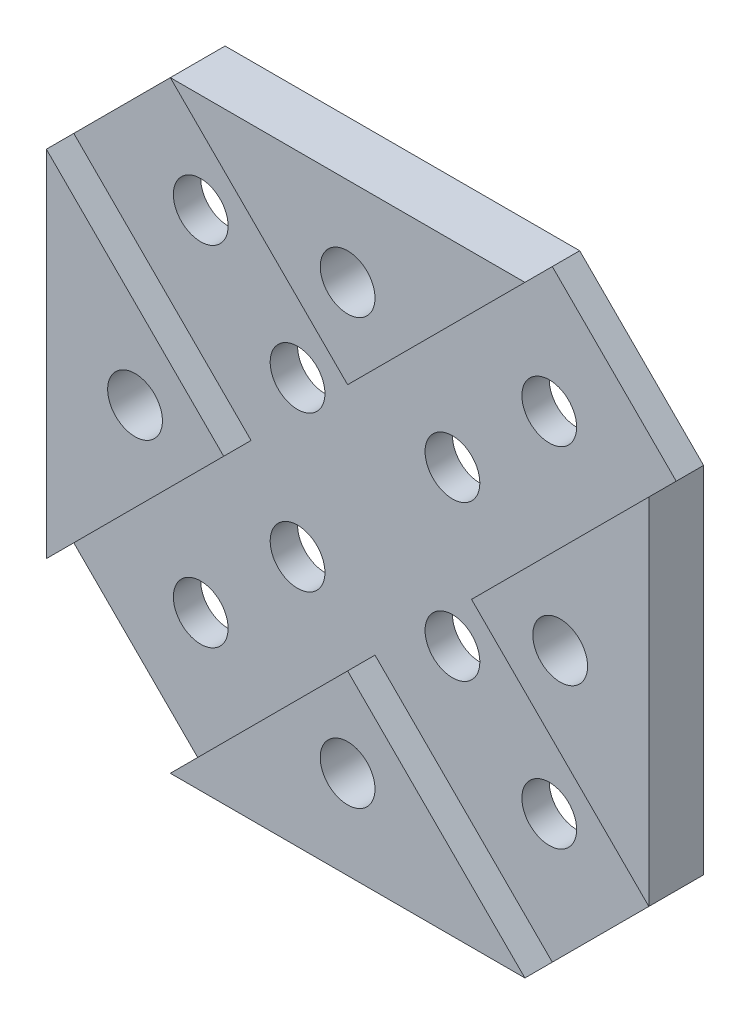
ISO-10303-21;
HEADER;
FILE_DESCRIPTION(('STEP AP214'),'2;1');
FILE_NAME('part.step','',(''),(''),'','','');
FILE_SCHEMA(('AUTOMOTIVE_DESIGN { 1 0 10303 214 1 1 1 1 }'));
ENDSEC;
DATA;
#1=APPLICATION_CONTEXT('core data for automotive mechanical design processes');
#2=APPLICATION_PROTOCOL_DEFINITION('international standard','automotive_design',2000,#1);
#3=PRODUCT_CONTEXT('',#1,'mechanical');
#4=PRODUCT('Part','Part','',(#3));
#5=PRODUCT_RELATED_PRODUCT_CATEGORY('part','',(#4));
#6=PRODUCT_DEFINITION_FORMATION('','',#4);
#7=PRODUCT_DEFINITION_CONTEXT('part definition',#1,'design');
#8=PRODUCT_DEFINITION('design','',#6,#7);
#9=PRODUCT_DEFINITION_SHAPE('','',#8);
#10=(LENGTH_UNIT() NAMED_UNIT(*) SI_UNIT(.MILLI.,.METRE.));
#11=(NAMED_UNIT(*) PLANE_ANGLE_UNIT() SI_UNIT($,.RADIAN.));
#12=(NAMED_UNIT(*) SI_UNIT($,.STERADIAN.) SOLID_ANGLE_UNIT());
#13=UNCERTAINTY_MEASURE_WITH_UNIT(LENGTH_MEASURE(1.E-05),#10,'distance_accuracy_value','');
#14=(GEOMETRIC_REPRESENTATION_CONTEXT(3) GLOBAL_UNCERTAINTY_ASSIGNED_CONTEXT((#13)) GLOBAL_UNIT_ASSIGNED_CONTEXT((#10,
#11,#12)) REPRESENTATION_CONTEXT('',''));
#15=CARTESIAN_POINT('',(0.,0.,0.));
#16=DIRECTION('',(0.,0.,1.));
#17=DIRECTION('',(1.,0.,0.));
#18=AXIS2_PLACEMENT_3D('',#15,#16,#17);
#19=CARTESIAN_POINT('',(0.,0.,10.));
#20=DIRECTION('',(0.,0.,1.));
#21=DIRECTION('',(1.,0.,0.));
#22=AXIS2_PLACEMENT_3D('',#19,#20,#21);
#23=PLANE('',#22);
#24=CARTESIAN_POINT('',(0.,38.8137084989848,10.));
#25=DIRECTION('',(0.,0.,1.));
#26=DIRECTION('',(1.,0.,0.));
#27=AXIS2_PLACEMENT_3D('',#24,#25,#26);
#28=CIRCLE('',#27,5.);
#29=CARTESIAN_POINT('',(4.99999999999997,38.8137084989848,10.));
#30=VERTEX_POINT('',#29);
#31=EDGE_CURVE('E530',#30,#30,#28,.T.);
#32=ORIENTED_EDGE('',*,*,#31,.F.);
#33=EDGE_LOOP('',(#32));
#34=FACE_BOUND('',#33,.T.);
#35=DIRECTION('',(-0.707106781186548,0.707106781186548,0.));
#36=VECTOR('',#35,1.);
#37=CARTESIAN_POINT('',(-32.3725830020304,55.,10.));
#38=LINE('',#37,#36);
#39=CARTESIAN_POINT('',(0.,22.6274169979695,10.));
#40=VERTEX_POINT('',#39);
#41=CARTESIAN_POINT('',(-32.3725830020304,55.,10.));
#42=VERTEX_POINT('',#41);
#43=EDGE_CURVE('E171',#40,#42,#38,.T.);
#44=ORIENTED_EDGE('',*,*,#43,.F.);
#45=DIRECTION('',(-0.707106781186547,-0.707106781186548,0.));
#46=VECTOR('',#45,1.);
#47=CARTESIAN_POINT('',(32.3725830020304,55.,10.));
#48=LINE('',#47,#46);
#49=CARTESIAN_POINT('',(32.3725830020304,55.,10.));
#50=VERTEX_POINT('',#49);
#51=EDGE_CURVE('E173',#50,#40,#48,.T.);
#52=ORIENTED_EDGE('',*,*,#51,.F.);
#53=DIRECTION('',(-1.,0.,0.));
#54=VECTOR('',#53,1.);
#55=CARTESIAN_POINT('',(0.,55.,10.));
#56=LINE('',#55,#54);
#57=EDGE_CURVE('E235',#50,#42,#56,.T.);
#58=ORIENTED_EDGE('',*,*,#57,.T.);
#59=EDGE_LOOP('',(#44,#52,#58));
#60=FACE_BOUND('',#59,.T.);
#61=ADVANCED_FACE('F35',(#34,#60),#23,.T.);
#62=CARTESIAN_POINT('',(38.8137084989859,1.10447462843078E-12,10.));
#63=DIRECTION('',(0.,0.,1.));
#64=DIRECTION('',(1.,0.,0.));
#65=AXIS2_PLACEMENT_3D('',#62,#63,#64);
#66=CIRCLE('',#65,5.00000000000084);
#67=CARTESIAN_POINT('',(43.8137084989867,1.10447462843078E-12,10.));
#68=VERTEX_POINT('',#67);
#69=EDGE_CURVE('E562',#68,#68,#66,.T.);
#70=ORIENTED_EDGE('',*,*,#69,.F.);
#71=EDGE_LOOP('',(#70));
#72=FACE_BOUND('',#71,.T.);
#73=DIRECTION('',(0.707106781186547,0.707106781186548,0.));
#74=VECTOR('',#73,1.);
#75=CARTESIAN_POINT('',(22.6274169979695,0.,10.));
#76=LINE('',#75,#74);
#77=CARTESIAN_POINT('',(22.6274169979695,0.,10.));
#78=VERTEX_POINT('',#77);
#79=CARTESIAN_POINT('',(55.,32.3725830020305,10.));
#80=VERTEX_POINT('',#79);
#81=EDGE_CURVE('E215',#78,#80,#76,.T.);
#82=ORIENTED_EDGE('',*,*,#81,.F.);
#83=DIRECTION('',(-0.707106781186547,0.707106781186548,0.));
#84=VECTOR('',#83,1.);
#85=CARTESIAN_POINT('',(22.6274169979695,0.,10.));
#86=LINE('',#85,#84);
#87=CARTESIAN_POINT('',(55.,-32.3725830020305,10.));
#88=VERTEX_POINT('',#87);
#89=EDGE_CURVE('E212',#88,#78,#86,.T.);
#90=ORIENTED_EDGE('',*,*,#89,.F.);
#91=DIRECTION('',(0.,1.,0.));
#92=VECTOR('',#91,1.);
#93=CARTESIAN_POINT('',(55.,0.,10.));
#94=LINE('',#93,#92);
#95=EDGE_CURVE('E232',#88,#80,#94,.T.);
#96=ORIENTED_EDGE('',*,*,#95,.T.);
#97=EDGE_LOOP('',(#82,#90,#96));
#98=FACE_BOUND('',#97,.T.);
#99=ADVANCED_FACE('F326',(#72,#98),#23,.T.);
#100=CARTESIAN_POINT('',(2.20894925686155E-12,-38.8137084989848,10.));
#101=DIRECTION('',(0.,0.,1.));
#102=DIRECTION('',(1.,0.,0.));
#103=AXIS2_PLACEMENT_3D('',#100,#101,#102);
#104=CIRCLE('',#103,5.00000000000235);
#105=CARTESIAN_POINT('',(5.00000000000456,-38.8137084989848,10.));
#106=VERTEX_POINT('',#105);
#107=EDGE_CURVE('E362',#106,#106,#104,.T.);
#108=ORIENTED_EDGE('',*,*,#107,.F.);
#109=EDGE_LOOP('',(#108));
#110=FACE_BOUND('',#109,.T.);
#111=DIRECTION('',(0.707106781186548,-0.707106781186547,0.));
#112=VECTOR('',#111,1.);
#113=CARTESIAN_POINT('',(32.3725830020306,-54.9999999999999,10.));
#114=LINE('',#113,#112);
#115=CARTESIAN_POINT('',(0.,-22.6274169979695,10.));
#116=VERTEX_POINT('',#115);
#117=CARTESIAN_POINT('',(32.3725830020306,-54.9999999999999,10.));
#118=VERTEX_POINT('',#117);
#119=EDGE_CURVE('E210',#116,#118,#114,.T.);
#120=ORIENTED_EDGE('',*,*,#119,.F.);
#121=DIRECTION('',(0.707106781186547,0.707106781186548,0.));
#122=VECTOR('',#121,1.);
#123=CARTESIAN_POINT('',(-32.3725830020304,-55.,10.));
#124=LINE('',#123,#122);
#125=CARTESIAN_POINT('',(-32.3725830020304,-55.,10.));
#126=VERTEX_POINT('',#125);
#127=EDGE_CURVE('E207',#126,#116,#124,.T.);
#128=ORIENTED_EDGE('',*,*,#127,.F.);
#129=DIRECTION('',(-1.,0.,0.));
#130=VECTOR('',#129,1.);
#131=CARTESIAN_POINT('',(0.,-55.,10.));
#132=LINE('',#131,#130);
#133=EDGE_CURVE('E228',#118,#126,#132,.T.);
#134=ORIENTED_EDGE('',*,*,#133,.F.);
#135=EDGE_LOOP('',(#120,#128,#134));
#136=FACE_BOUND('',#135,.T.);
#137=ADVANCED_FACE('F333',(#110,#136),#23,.T.);
#138=CARTESIAN_POINT('',(-55.,0.,10.));
#139=DIRECTION('',(-1.,0.,0.));
#140=DIRECTION('',(0.,0.,1.));
#141=AXIS2_PLACEMENT_3D('',#138,#139,#140);
#142=PLANE('',#141);
#143=DIRECTION('',(0.,1.,0.));
#144=VECTOR('',#143,1.);
#145=CARTESIAN_POINT('',(-55.,0.,0.));
#146=LINE('',#145,#144);
#147=CARTESIAN_POINT('',(-55.,-32.3725830020305,0.));
#148=VERTEX_POINT('',#147);
#149=CARTESIAN_POINT('',(-55.,32.3725830020305,0.));
#150=VERTEX_POINT('',#149);
#151=EDGE_CURVE('E221',#148,#150,#146,.T.);
#152=ORIENTED_EDGE('',*,*,#151,.F.);
#153=DIRECTION('',(0.,0.,-1.));
#154=VECTOR('',#153,1.);
#155=CARTESIAN_POINT('',(-55.,-32.3725830020305,10.));
#156=LINE('',#155,#154);
#157=CARTESIAN_POINT('',(-55.,-32.3725830020305,5.));
#158=VERTEX_POINT('',#157);
#159=EDGE_CURVE('E44',#158,#148,#156,.T.);
#160=ORIENTED_EDGE('',*,*,#159,.F.);
#161=CARTESIAN_POINT('',(-55.,-32.3725830020305,10.));
#162=VERTEX_POINT('',#161);
#163=EDGE_CURVE('E11',#162,#158,#156,.T.);
#164=ORIENTED_EDGE('',*,*,#163,.F.);
#165=DIRECTION('',(0.,1.,0.));
#166=VECTOR('',#165,1.);
#167=CARTESIAN_POINT('',(-55.,0.,10.));
#168=LINE('',#167,#166);
#169=CARTESIAN_POINT('',(-55.,32.3725830020305,10.));
#170=VERTEX_POINT('',#169);
#171=EDGE_CURVE('E225',#162,#170,#168,.T.);
#172=ORIENTED_EDGE('',*,*,#171,.T.);
#173=DIRECTION('',(0.,0.,-1.));
#174=VECTOR('',#173,1.);
#175=CARTESIAN_POINT('',(-55.,32.3725830020305,10.));
#176=LINE('',#175,#174);
#177=CARTESIAN_POINT('',(-55.,32.3725830020305,5.));
#178=VERTEX_POINT('',#177);
#179=EDGE_CURVE('E259',#170,#178,#176,.T.);
#180=ORIENTED_EDGE('',*,*,#179,.T.);
#181=EDGE_CURVE('E60',#178,#150,#176,.T.);
#182=ORIENTED_EDGE('',*,*,#181,.T.);
#183=EDGE_LOOP('',(#152,#160,#164,#172,#180,#182));
#184=FACE_BOUND('',#183,.T.);
#185=ADVANCED_FACE('F37',(#184),#142,.T.);
#186=CARTESIAN_POINT('',(-43.6862915010151,-43.6862915010153,10.));
#187=DIRECTION('',(0.707106781186546,0.707106781186549,0.));
#188=DIRECTION('',(-0.707106781186549,0.707106781186546,0.));
#189=AXIS2_PLACEMENT_3D('',#186,#187,#188);
#190=PLANE('',#189);
#191=DIRECTION('',(0.,0.,-1.));
#192=VECTOR('',#191,1.);
#193=CARTESIAN_POINT('',(-32.3725830020304,-55.,10.));
#194=LINE('',#193,#192);
#195=CARTESIAN_POINT('',(-32.3725830020304,-55.,5.));
#196=VERTEX_POINT('',#195);
#197=CARTESIAN_POINT('',(-32.3725830020304,-55.,0.));
#198=VERTEX_POINT('',#197);
#199=EDGE_CURVE('E278',#196,#198,#194,.T.);
#200=ORIENTED_EDGE('',*,*,#199,.F.);
#201=DIRECTION('',(0.707106781186549,-0.707106781186546,0.));
#202=VECTOR('',#201,1.);
#203=CARTESIAN_POINT('',(-55.,-32.3725830020305,5.));
#204=LINE('',#203,#202);
#205=EDGE_CURVE('E166',#158,#196,#204,.T.);
#206=ORIENTED_EDGE('',*,*,#205,.F.);
#207=ORIENTED_EDGE('',*,*,#159,.T.);
#208=DIRECTION('',(0.707106781186549,-0.707106781186546,0.));
#209=VECTOR('',#208,1.);
#210=CARTESIAN_POINT('',(-43.6862915010151,-43.6862915010153,0.));
#211=LINE('',#210,#209);
#212=EDGE_CURVE('E239',#148,#198,#211,.T.);
#213=ORIENTED_EDGE('',*,*,#212,.T.);
#214=EDGE_LOOP('',(#200,#206,#207,#213));
#215=FACE_BOUND('',#214,.T.);
#216=ADVANCED_FACE('F358',(#215),#190,.F.);
#217=CARTESIAN_POINT('',(0.,-55.,10.));
#218=DIRECTION('',(0.,-1.,0.));
#219=DIRECTION('',(0.,0.,-1.));
#220=AXIS2_PLACEMENT_3D('',#217,#218,#219);
#221=PLANE('',#220);
#222=DIRECTION('',(-1.,0.,0.));
#223=VECTOR('',#222,1.);
#224=CARTESIAN_POINT('',(0.,-55.,0.));
#225=LINE('',#224,#223);
#226=CARTESIAN_POINT('',(32.3725830020304,-55.,0.));
#227=VERTEX_POINT('',#226);
#228=EDGE_CURVE('E242',#227,#198,#225,.T.);
#229=ORIENTED_EDGE('',*,*,#228,.F.);
#230=DIRECTION('',(0.,0.,-1.));
#231=VECTOR('',#230,1.);
#232=CARTESIAN_POINT('',(32.3725830020304,-55.,10.));
#233=LINE('',#232,#231);
#234=CARTESIAN_POINT('',(32.3725830020306,-54.9999999999999,5.));
#235=VERTEX_POINT('',#234);
#236=EDGE_CURVE('E275',#235,#227,#233,.T.);
#237=ORIENTED_EDGE('',*,*,#236,.F.);
#238=EDGE_CURVE('E276',#118,#235,#233,.T.);
#239=ORIENTED_EDGE('',*,*,#238,.F.);
#240=ORIENTED_EDGE('',*,*,#133,.T.);
#241=EDGE_CURVE('E279',#126,#196,#194,.T.);
#242=ORIENTED_EDGE('',*,*,#241,.T.);
#243=ORIENTED_EDGE('',*,*,#199,.T.);
#244=EDGE_LOOP('',(#229,#237,#239,#240,#242,#243));
#245=FACE_BOUND('',#244,.T.);
#246=ADVANCED_FACE('F373',(#245),#221,.T.);
#247=CARTESIAN_POINT('',(43.6862915010151,-43.6862915010153,10.));
#248=DIRECTION('',(0.707106781186546,-0.707106781186549,0.));
#249=DIRECTION('',(0.707106781186549,0.707106781186546,0.));
#250=AXIS2_PLACEMENT_3D('',#247,#248,#249);
#251=PLANE('',#250);
#252=DIRECTION('',(0.707106781186547,0.707106781186548,0.));
#253=VECTOR('',#252,1.);
#254=CARTESIAN_POINT('',(55.,-32.3725830020305,5.));
#255=LINE('',#254,#253);
#256=CARTESIAN_POINT('',(55.,-32.3725830020305,5.));
#257=VERTEX_POINT('',#256);
#258=EDGE_CURVE('E186',#235,#257,#255,.T.);
#259=ORIENTED_EDGE('',*,*,#258,.F.);
#260=ORIENTED_EDGE('',*,*,#236,.T.);
#261=DIRECTION('',(-0.707106781186549,-0.707106781186546,0.));
#262=VECTOR('',#261,1.);
#263=CARTESIAN_POINT('',(43.6862915010151,-43.6862915010153,0.));
#264=LINE('',#263,#262);
#265=CARTESIAN_POINT('',(55.,-32.3725830020305,0.));
#266=VERTEX_POINT('',#265);
#267=EDGE_CURVE('E245',#266,#227,#264,.T.);
#268=ORIENTED_EDGE('',*,*,#267,.F.);
#269=DIRECTION('',(0.,0.,-1.));
#270=VECTOR('',#269,1.);
#271=CARTESIAN_POINT('',(55.,-32.3725830020305,10.));
#272=LINE('',#271,#270);
#273=EDGE_CURVE('E271',#257,#266,#272,.T.);
#274=ORIENTED_EDGE('',*,*,#273,.F.);
#275=EDGE_LOOP('',(#259,#260,#268,#274));
#276=FACE_BOUND('',#275,.T.);
#277=ADVANCED_FACE('F377',(#276),#251,.T.);
#278=CARTESIAN_POINT('',(55.,0.,10.));
#279=DIRECTION('',(-1.,0.,0.));
#280=DIRECTION('',(0.,0.,1.));
#281=AXIS2_PLACEMENT_3D('',#278,#279,#280);
#282=PLANE('',#281);
#283=DIRECTION('',(0.,1.,0.));
#284=VECTOR('',#283,1.);
#285=CARTESIAN_POINT('',(55.,0.,0.));
#286=LINE('',#285,#284);
#287=CARTESIAN_POINT('',(55.,32.3725830020305,0.));
#288=VERTEX_POINT('',#287);
#289=EDGE_CURVE('E248',#266,#288,#286,.T.);
#290=ORIENTED_EDGE('',*,*,#289,.T.);
#291=DIRECTION('',(0.,0.,-1.));
#292=VECTOR('',#291,1.);
#293=CARTESIAN_POINT('',(55.,32.3725830020305,10.));
#294=LINE('',#293,#292);
#295=CARTESIAN_POINT('',(55.,32.3725830020305,5.));
#296=VERTEX_POINT('',#295);
#297=EDGE_CURVE('E268',#296,#288,#294,.T.);
#298=ORIENTED_EDGE('',*,*,#297,.F.);
#299=EDGE_CURVE('E269',#80,#296,#294,.T.);
#300=ORIENTED_EDGE('',*,*,#299,.F.);
#301=ORIENTED_EDGE('',*,*,#95,.F.);
#302=EDGE_CURVE('E272',#88,#257,#272,.T.);
#303=ORIENTED_EDGE('',*,*,#302,.T.);
#304=ORIENTED_EDGE('',*,*,#273,.T.);
#305=EDGE_LOOP('',(#290,#298,#300,#301,#303,#304));
#306=FACE_BOUND('',#305,.T.);
#307=ADVANCED_FACE('F391',(#306),#282,.F.);
#308=CARTESIAN_POINT('',(43.6862915010151,43.6862915010153,10.));
#309=DIRECTION('',(-0.707106781186546,-0.707106781186549,0.));
#310=DIRECTION('',(0.707106781186549,-0.707106781186546,0.));
#311=AXIS2_PLACEMENT_3D('',#308,#309,#310);
#312=PLANE('',#311);
#313=DIRECTION('',(0.,0.,-1.));
#314=VECTOR('',#313,1.);
#315=CARTESIAN_POINT('',(32.3725830020304,55.,10.));
#316=LINE('',#315,#314);
#317=CARTESIAN_POINT('',(32.3725830020304,55.,5.));
#318=VERTEX_POINT('',#317);
#319=CARTESIAN_POINT('',(32.3725830020304,55.,0.));
#320=VERTEX_POINT('',#319);
#321=EDGE_CURVE('E264',#318,#320,#316,.T.);
#322=ORIENTED_EDGE('',*,*,#321,.F.);
#323=DIRECTION('',(-0.707106781186549,0.707106781186546,0.));
#324=VECTOR('',#323,1.);
#325=CARTESIAN_POINT('',(32.3725830020304,55.,5.));
#326=LINE('',#325,#324);
#327=EDGE_CURVE('E195',#296,#318,#326,.T.);
#328=ORIENTED_EDGE('',*,*,#327,.F.);
#329=ORIENTED_EDGE('',*,*,#297,.T.);
#330=DIRECTION('',(-0.707106781186549,0.707106781186546,0.));
#331=VECTOR('',#330,1.);
#332=CARTESIAN_POINT('',(43.6862915010151,43.6862915010153,0.));
#333=LINE('',#332,#331);
#334=EDGE_CURVE('E251',#288,#320,#333,.T.);
#335=ORIENTED_EDGE('',*,*,#334,.T.);
#336=EDGE_LOOP('',(#322,#328,#329,#335));
#337=FACE_BOUND('',#336,.T.);
#338=ADVANCED_FACE('F405',(#337),#312,.F.);
#339=CARTESIAN_POINT('',(0.,55.,10.));
#340=DIRECTION('',(0.,-1.,0.));
#341=DIRECTION('',(0.,0.,-1.));
#342=AXIS2_PLACEMENT_3D('',#339,#340,#341);
#343=PLANE('',#342);
#344=DIRECTION('',(-1.,0.,0.));
#345=VECTOR('',#344,1.);
#346=CARTESIAN_POINT('',(0.,55.,0.));
#347=LINE('',#346,#345);
#348=CARTESIAN_POINT('',(-32.3725830020304,55.,0.));
#349=VERTEX_POINT('',#348);
#350=EDGE_CURVE('E254',#320,#349,#347,.T.);
#351=ORIENTED_EDGE('',*,*,#350,.T.);
#352=DIRECTION('',(0.,0.,-1.));
#353=VECTOR('',#352,1.);
#354=CARTESIAN_POINT('',(-32.3725830020304,55.,10.));
#355=LINE('',#354,#353);
#356=CARTESIAN_POINT('',(-32.3725830020304,55.,5.));
#357=VERTEX_POINT('',#356);
#358=EDGE_CURVE('E261',#357,#349,#355,.T.);
#359=ORIENTED_EDGE('',*,*,#358,.F.);
#360=EDGE_CURVE('E262',#42,#357,#355,.T.);
#361=ORIENTED_EDGE('',*,*,#360,.F.);
#362=ORIENTED_EDGE('',*,*,#57,.F.);
#363=EDGE_CURVE('E265',#50,#318,#316,.T.);
#364=ORIENTED_EDGE('',*,*,#363,.T.);
#365=ORIENTED_EDGE('',*,*,#321,.T.);
#366=EDGE_LOOP('',(#351,#359,#361,#362,#364,#365));
#367=FACE_BOUND('',#366,.T.);
#368=ADVANCED_FACE('F348',(#367),#343,.F.);
#369=CARTESIAN_POINT('',(-43.6862915010151,43.6862915010153,10.));
#370=DIRECTION('',(-0.707106781186546,0.707106781186549,0.));
#371=DIRECTION('',(-0.707106781186549,-0.707106781186546,0.));
#372=AXIS2_PLACEMENT_3D('',#369,#370,#371);
#373=PLANE('',#372);
#374=DIRECTION('',(-0.707106781186549,-0.707106781186546,0.));
#375=VECTOR('',#374,1.);
#376=CARTESIAN_POINT('',(-55.,32.3725830020305,5.));
#377=LINE('',#376,#375);
#378=EDGE_CURVE('E157',#357,#178,#377,.T.);
#379=ORIENTED_EDGE('',*,*,#378,.F.);
#380=ORIENTED_EDGE('',*,*,#358,.T.);
#381=DIRECTION('',(0.707106781186549,0.707106781186546,0.));
#382=VECTOR('',#381,1.);
#383=CARTESIAN_POINT('',(-43.6862915010151,43.6862915010153,0.));
#384=LINE('',#383,#382);
#385=EDGE_CURVE('E229',#150,#349,#384,.T.);
#386=ORIENTED_EDGE('',*,*,#385,.F.);
#387=ORIENTED_EDGE('',*,*,#181,.F.);
#388=EDGE_LOOP('',(#379,#380,#386,#387));
#389=FACE_BOUND('',#388,.T.);
#390=ADVANCED_FACE('F341',(#389),#373,.T.);
#391=CARTESIAN_POINT('',(-38.8137084989837,-1.10922793681841E-12,10.));
#392=DIRECTION('',(0.,0.,1.));
#393=DIRECTION('',(1.,0.,0.));
#394=AXIS2_PLACEMENT_3D('',#391,#392,#393);
#395=CIRCLE('',#394,5.00000000000175);
#396=CARTESIAN_POINT('',(-33.8137084989819,-1.10922793681841E-12,10.));
#397=VERTEX_POINT('',#396);
#398=EDGE_CURVE('E519',#397,#397,#395,.T.);
#399=ORIENTED_EDGE('',*,*,#398,.F.);
#400=EDGE_LOOP('',(#399));
#401=FACE_BOUND('',#400,.T.);
#402=DIRECTION('',(0.707106781186548,-0.707106781186547,0.));
#403=VECTOR('',#402,1.);
#404=CARTESIAN_POINT('',(-22.6274169979694,0.,10.));
#405=LINE('',#404,#403);
#406=CARTESIAN_POINT('',(-22.6274169979694,0.,10.));
#407=VERTEX_POINT('',#406);
#408=EDGE_CURVE('E52',#170,#407,#405,.T.);
#409=ORIENTED_EDGE('',*,*,#408,.F.);
#410=ORIENTED_EDGE('',*,*,#171,.F.);
#411=DIRECTION('',(-0.707106781186549,-0.707106781186546,0.));
#412=VECTOR('',#411,1.);
#413=CARTESIAN_POINT('',(-22.6274169979694,0.,10.));
#414=LINE('',#413,#412);
#415=EDGE_CURVE('E205',#407,#162,#414,.T.);
#416=ORIENTED_EDGE('',*,*,#415,.F.);
#417=EDGE_LOOP('',(#409,#410,#416));
#418=FACE_BOUND('',#417,.T.);
#419=ADVANCED_FACE('F329',(#401,#418),#23,.T.);
#420=CARTESIAN_POINT('',(0.,0.,0.));
#421=DIRECTION('',(0.,0.,1.));
#422=DIRECTION('',(1.,0.,0.));
#423=AXIS2_PLACEMENT_3D('',#420,#421,#422);
#424=PLANE('',#423);
#425=CARTESIAN_POINT('',(14.1421356237279,-14.1421356237341,0.));
#426=DIRECTION('',(0.,0.,1.));
#427=DIRECTION('',(1.,0.,0.));
#428=AXIS2_PLACEMENT_3D('',#425,#426,#427);
#429=CIRCLE('',#428,5.);
#430=CARTESIAN_POINT('',(19.1421356237279,-14.1421356237341,0.));
#431=VERTEX_POINT('',#430);
#432=EDGE_CURVE('E486',#431,#431,#429,.T.);
#433=ORIENTED_EDGE('',*,*,#432,.T.);
#434=EDGE_LOOP('',(#433));
#435=FACE_BOUND('',#434,.T.);
#436=CARTESIAN_POINT('',(-31.819805153405,-31.8198051533843,0.));
#437=DIRECTION('',(0.,0.,1.));
#438=DIRECTION('',(1.,0.,0.));
#439=AXIS2_PLACEMENT_3D('',#436,#437,#438);
#440=CIRCLE('',#439,5.);
#441=CARTESIAN_POINT('',(-26.819805153405,-31.8198051533843,0.));
#442=VERTEX_POINT('',#441);
#443=EDGE_CURVE('E489',#442,#442,#440,.T.);
#444=ORIENTED_EDGE('',*,*,#443,.T.);
#445=EDGE_LOOP('',(#444));
#446=FACE_BOUND('',#445,.T.);
#447=CARTESIAN_POINT('',(-14.1421356237356,-14.1421356237263,0.));
#448=DIRECTION('',(0.,0.,1.));
#449=DIRECTION('',(1.,0.,0.));
#450=AXIS2_PLACEMENT_3D('',#447,#448,#449);
#451=CIRCLE('',#450,5.);
#452=CARTESIAN_POINT('',(-9.14213562373558,-14.1421356237263,0.));
#453=VERTEX_POINT('',#452);
#454=EDGE_CURVE('E526',#453,#453,#451,.T.);
#455=ORIENTED_EDGE('',*,*,#454,.T.);
#456=EDGE_LOOP('',(#455));
#457=FACE_BOUND('',#456,.T.);
#458=CARTESIAN_POINT('',(0.,38.8137084989848,0.));
#459=DIRECTION('',(0.,0.,1.));
#460=DIRECTION('',(1.,0.,0.));
#461=AXIS2_PLACEMENT_3D('',#458,#459,#460);
#462=CIRCLE('',#461,5.);
#463=CARTESIAN_POINT('',(4.99999999999997,38.8137084989848,0.));
#464=VERTEX_POINT('',#463);
#465=EDGE_CURVE('E529',#464,#464,#462,.T.);
#466=ORIENTED_EDGE('',*,*,#465,.T.);
#467=EDGE_LOOP('',(#466));
#468=FACE_BOUND('',#467,.T.);
#469=CARTESIAN_POINT('',(-14.1421356237309,14.142135623731,0.));
#470=DIRECTION('',(0.,0.,1.));
#471=DIRECTION('',(1.,0.,0.));
#472=AXIS2_PLACEMENT_3D('',#469,#470,#471);
#473=CIRCLE('',#472,5.);
#474=CARTESIAN_POINT('',(-9.14213562373094,14.142135623731,0.));
#475=VERTEX_POINT('',#474);
#476=EDGE_CURVE('E484',#475,#475,#473,.T.);
#477=ORIENTED_EDGE('',*,*,#476,.T.);
#478=EDGE_LOOP('',(#477));
#479=FACE_BOUND('',#478,.T.);
#480=CARTESIAN_POINT('',(31.8198051533981,31.8198051533912,0.));
#481=DIRECTION('',(0.,0.,1.));
#482=DIRECTION('',(1.,0.,0.));
#483=AXIS2_PLACEMENT_3D('',#480,#481,#482);
#484=CIRCLE('',#483,5.);
#485=CARTESIAN_POINT('',(36.8198051533981,31.8198051533912,0.));
#486=VERTEX_POINT('',#485);
#487=EDGE_CURVE('E480',#486,#486,#484,.T.);
#488=ORIENTED_EDGE('',*,*,#487,.T.);
#489=EDGE_LOOP('',(#488));
#490=FACE_BOUND('',#489,.T.);
#491=CARTESIAN_POINT('',(14.1421356237325,14.1421356237294,0.));
#492=DIRECTION('',(0.,0.,1.));
#493=DIRECTION('',(1.,0.,0.));
#494=AXIS2_PLACEMENT_3D('',#491,#492,#493);
#495=CIRCLE('',#494,5.);
#496=CARTESIAN_POINT('',(19.1421356237325,14.1421356237294,0.));
#497=VERTEX_POINT('',#496);
#498=EDGE_CURVE('E471',#497,#497,#495,.T.);
#499=ORIENTED_EDGE('',*,*,#498,.T.);
#500=EDGE_LOOP('',(#499));
#501=FACE_BOUND('',#500,.T.);
#502=CARTESIAN_POINT('',(31.8198051533877,-31.8198051534016,0.));
#503=DIRECTION('',(0.,0.,1.));
#504=DIRECTION('',(1.,0.,0.));
#505=AXIS2_PLACEMENT_3D('',#502,#503,#504);
#506=CIRCLE('',#505,5.);
#507=CARTESIAN_POINT('',(36.8198051533877,-31.8198051534016,0.));
#508=VERTEX_POINT('',#507);
#509=EDGE_CURVE('E481',#508,#508,#506,.T.);
#510=ORIENTED_EDGE('',*,*,#509,.T.);
#511=EDGE_LOOP('',(#510));
#512=FACE_BOUND('',#511,.T.);
#513=CARTESIAN_POINT('',(38.8137084989859,1.10447462843078E-12,0.));
#514=DIRECTION('',(0.,0.,1.));
#515=DIRECTION('',(1.,0.,0.));
#516=AXIS2_PLACEMENT_3D('',#513,#514,#515);
#517=CIRCLE('',#516,5.00000000000084);
#518=CARTESIAN_POINT('',(43.8137084989867,1.10447462843078E-12,0.));
#519=VERTEX_POINT('',#518);
#520=EDGE_CURVE('E511',#519,#519,#517,.T.);
#521=ORIENTED_EDGE('',*,*,#520,.T.);
#522=EDGE_LOOP('',(#521));
#523=FACE_BOUND('',#522,.T.);
#524=CARTESIAN_POINT('',(2.20894925686155E-12,-38.8137084989848,0.));
#525=DIRECTION('',(0.,0.,1.));
#526=DIRECTION('',(1.,0.,0.));
#527=AXIS2_PLACEMENT_3D('',#524,#525,#526);
#528=CIRCLE('',#527,5.00000000000235);
#529=CARTESIAN_POINT('',(5.00000000000456,-38.8137084989848,0.));
#530=VERTEX_POINT('',#529);
#531=EDGE_CURVE('E515',#530,#530,#528,.T.);
#532=ORIENTED_EDGE('',*,*,#531,.T.);
#533=EDGE_LOOP('',(#532));
#534=FACE_BOUND('',#533,.T.);
#535=CARTESIAN_POINT('',(-38.8137084989837,-1.10922793681841E-12,0.));
#536=DIRECTION('',(0.,0.,1.));
#537=DIRECTION('',(1.,0.,0.));
#538=AXIS2_PLACEMENT_3D('',#535,#536,#537);
#539=CIRCLE('',#538,5.00000000000175);
#540=CARTESIAN_POINT('',(-33.8137084989819,-1.10922793681841E-12,0.));
#541=VERTEX_POINT('',#540);
#542=EDGE_CURVE('E518',#541,#541,#539,.T.);
#543=ORIENTED_EDGE('',*,*,#542,.T.);
#544=EDGE_LOOP('',(#543));
#545=FACE_BOUND('',#544,.T.);
#546=CARTESIAN_POINT('',(-31.8198051533946,31.8198051533946,0.));
#547=DIRECTION('',(0.,0.,1.));
#548=DIRECTION('',(1.,0.,0.));
#549=AXIS2_PLACEMENT_3D('',#546,#547,#548);
#550=CIRCLE('',#549,4.99999999999999);
#551=CARTESIAN_POINT('',(-26.8198051533946,31.8198051533946,0.));
#552=VERTEX_POINT('',#551);
#553=EDGE_CURVE('E176',#552,#552,#550,.T.);
#554=ORIENTED_EDGE('',*,*,#553,.T.);
#555=EDGE_LOOP('',(#554));
#556=FACE_BOUND('',#555,.T.);
#557=ORIENTED_EDGE('',*,*,#151,.T.);
#558=ORIENTED_EDGE('',*,*,#385,.T.);
#559=ORIENTED_EDGE('',*,*,#350,.F.);
#560=ORIENTED_EDGE('',*,*,#334,.F.);
#561=ORIENTED_EDGE('',*,*,#289,.F.);
#562=ORIENTED_EDGE('',*,*,#267,.T.);
#563=ORIENTED_EDGE('',*,*,#228,.T.);
#564=ORIENTED_EDGE('',*,*,#212,.F.);
#565=EDGE_LOOP('',(#557,#558,#559,#560,#561,#562,#563,#564));
#566=FACE_BOUND('',#565,.T.);
#567=ADVANCED_FACE('F340',(#435,#446,#457,#468,#479,#490,#501,#512,#523,#534,#545,#556,#566),
#424,.F.);
#568=CARTESIAN_POINT('',(-22.6274169979694,0.,5.));
#569=DIRECTION('',(-0.707106781186547,-0.707106781186548,0.));
#570=DIRECTION('',(0.707106781186548,-0.707106781186547,0.));
#571=AXIS2_PLACEMENT_3D('',#568,#569,#570);
#572=PLANE('',#571);
#573=ORIENTED_EDGE('',*,*,#408,.T.);
#574=DIRECTION('',(0.,0.,1.));
#575=VECTOR('',#574,1.);
#576=CARTESIAN_POINT('',(-22.6274169979694,0.,5.));
#577=LINE('',#576,#575);
#578=CARTESIAN_POINT('',(-22.6274169979694,0.,5.));
#579=VERTEX_POINT('',#578);
#580=EDGE_CURVE('E148',#579,#407,#577,.T.);
#581=ORIENTED_EDGE('',*,*,#580,.F.);
#582=DIRECTION('',(0.707106781186548,-0.707106781186547,0.));
#583=VECTOR('',#582,1.);
#584=CARTESIAN_POINT('',(-22.6274169979694,0.,5.));
#585=LINE('',#584,#583);
#586=EDGE_CURVE('E152',#178,#579,#585,.T.);
#587=ORIENTED_EDGE('',*,*,#586,.F.);
#588=ORIENTED_EDGE('',*,*,#179,.F.);
#589=EDGE_LOOP('',(#573,#581,#587,#588));
#590=FACE_BOUND('',#589,.T.);
#591=ADVANCED_FACE('F150',(#590),#572,.F.);
#592=CARTESIAN_POINT('',(-32.3725830020304,55.,5.));
#593=DIRECTION('',(0.707106781186548,0.707106781186548,0.));
#594=DIRECTION('',(-0.707106781186548,0.707106781186548,0.));
#595=AXIS2_PLACEMENT_3D('',#592,#593,#594);
#596=PLANE('',#595);
#597=ORIENTED_EDGE('',*,*,#43,.T.);
#598=ORIENTED_EDGE('',*,*,#360,.T.);
#599=DIRECTION('',(-0.707106781186548,0.707106781186548,0.));
#600=VECTOR('',#599,1.);
#601=CARTESIAN_POINT('',(-32.3725830020304,55.,5.));
#602=LINE('',#601,#600);
#603=CARTESIAN_POINT('',(0.,22.6274169979695,5.));
#604=VERTEX_POINT('',#603);
#605=EDGE_CURVE('E201',#604,#357,#602,.T.);
#606=ORIENTED_EDGE('',*,*,#605,.F.);
#607=DIRECTION('',(0.,0.,1.));
#608=VECTOR('',#607,1.);
#609=CARTESIAN_POINT('',(0.,22.6274169979695,5.));
#610=LINE('',#609,#608);
#611=EDGE_CURVE('E219',#604,#40,#610,.T.);
#612=ORIENTED_EDGE('',*,*,#611,.T.);
#613=EDGE_LOOP('',(#597,#598,#606,#612));
#614=FACE_BOUND('',#613,.T.);
#615=ADVANCED_FACE('F414',(#614),#596,.F.);
#616=CARTESIAN_POINT('',(32.3725830020304,55.,5.));
#617=DIRECTION('',(-0.707106781186548,0.707106781186547,0.));
#618=DIRECTION('',(-0.707106781186547,-0.707106781186548,0.));
#619=AXIS2_PLACEMENT_3D('',#616,#617,#618);
#620=PLANE('',#619);
#621=ORIENTED_EDGE('',*,*,#51,.T.);
#622=ORIENTED_EDGE('',*,*,#611,.F.);
#623=DIRECTION('',(-0.707106781186547,-0.707106781186548,0.));
#624=VECTOR('',#623,1.);
#625=CARTESIAN_POINT('',(32.3725830020304,55.,5.));
#626=LINE('',#625,#624);
#627=EDGE_CURVE('E198',#318,#604,#626,.T.);
#628=ORIENTED_EDGE('',*,*,#627,.F.);
#629=ORIENTED_EDGE('',*,*,#363,.F.);
#630=EDGE_LOOP('',(#621,#622,#628,#629));
#631=FACE_BOUND('',#630,.T.);
#632=ADVANCED_FACE('F411',(#631),#620,.F.);
#633=CARTESIAN_POINT('',(22.6274169979695,0.,5.));
#634=DIRECTION('',(0.707106781186548,-0.707106781186547,0.));
#635=DIRECTION('',(0.707106781186547,0.707106781186548,0.));
#636=AXIS2_PLACEMENT_3D('',#633,#634,#635);
#637=PLANE('',#636);
#638=ORIENTED_EDGE('',*,*,#81,.T.);
#639=ORIENTED_EDGE('',*,*,#299,.T.);
#640=DIRECTION('',(0.707106781186547,0.707106781186548,0.));
#641=VECTOR('',#640,1.);
#642=CARTESIAN_POINT('',(22.6274169979695,0.,5.));
#643=LINE('',#642,#641);
#644=CARTESIAN_POINT('',(22.6274169979695,0.,5.));
#645=VERTEX_POINT('',#644);
#646=EDGE_CURVE('E192',#645,#296,#643,.T.);
#647=ORIENTED_EDGE('',*,*,#646,.F.);
#648=DIRECTION('',(0.,0.,1.));
#649=VECTOR('',#648,1.);
#650=CARTESIAN_POINT('',(22.6274169979695,0.,5.));
#651=LINE('',#650,#649);
#652=EDGE_CURVE('E222',#645,#78,#651,.T.);
#653=ORIENTED_EDGE('',*,*,#652,.T.);
#654=EDGE_LOOP('',(#638,#639,#647,#653));
#655=FACE_BOUND('',#654,.T.);
#656=ADVANCED_FACE('F400',(#655),#637,.F.);
#657=CARTESIAN_POINT('',(22.6274169979695,0.,5.));
#658=DIRECTION('',(0.707106781186548,0.707106781186547,0.));
#659=DIRECTION('',(-0.707106781186547,0.707106781186548,0.));
#660=AXIS2_PLACEMENT_3D('',#657,#658,#659);
#661=PLANE('',#660);
#662=ORIENTED_EDGE('',*,*,#89,.T.);
#663=ORIENTED_EDGE('',*,*,#652,.F.);
#664=DIRECTION('',(-0.707106781186547,0.707106781186548,0.));
#665=VECTOR('',#664,1.);
#666=CARTESIAN_POINT('',(22.6274169979695,0.,5.));
#667=LINE('',#666,#665);
#668=EDGE_CURVE('E189',#257,#645,#667,.T.);
#669=ORIENTED_EDGE('',*,*,#668,.F.);
#670=ORIENTED_EDGE('',*,*,#302,.F.);
#671=EDGE_LOOP('',(#662,#663,#669,#670));
#672=FACE_BOUND('',#671,.T.);
#673=ADVANCED_FACE('F396',(#672),#661,.F.);
#674=CARTESIAN_POINT('',(32.3725830020306,-54.9999999999999,5.));
#675=DIRECTION('',(-0.707106781186547,-0.707106781186548,0.));
#676=DIRECTION('',(0.707106781186548,-0.707106781186547,0.));
#677=AXIS2_PLACEMENT_3D('',#674,#675,#676);
#678=PLANE('',#677);
#679=ORIENTED_EDGE('',*,*,#119,.T.);
#680=ORIENTED_EDGE('',*,*,#238,.T.);
#681=DIRECTION('',(0.707106781186548,-0.707106781186547,0.));
#682=VECTOR('',#681,1.);
#683=CARTESIAN_POINT('',(32.3725830020306,-54.9999999999999,5.));
#684=LINE('',#683,#682);
#685=CARTESIAN_POINT('',(0.,-22.6274169979695,5.));
#686=VERTEX_POINT('',#685);
#687=EDGE_CURVE('E183',#686,#235,#684,.T.);
#688=ORIENTED_EDGE('',*,*,#687,.F.);
#689=DIRECTION('',(0.,0.,1.));
#690=VECTOR('',#689,1.);
#691=CARTESIAN_POINT('',(0.,-22.6274169979695,5.));
#692=LINE('',#691,#690);
#693=EDGE_CURVE('E156',#686,#116,#692,.T.);
#694=ORIENTED_EDGE('',*,*,#693,.T.);
#695=EDGE_LOOP('',(#679,#680,#688,#694));
#696=FACE_BOUND('',#695,.T.);
#697=ADVANCED_FACE('F368',(#696),#678,.F.);
#698=CARTESIAN_POINT('',(-32.3725830020304,-55.,5.));
#699=DIRECTION('',(0.707106781186548,-0.707106781186547,0.));
#700=DIRECTION('',(0.707106781186547,0.707106781186548,0.));
#701=AXIS2_PLACEMENT_3D('',#698,#699,#700);
#702=PLANE('',#701);
#703=ORIENTED_EDGE('',*,*,#127,.T.);
#704=ORIENTED_EDGE('',*,*,#693,.F.);
#705=DIRECTION('',(0.707106781186547,0.707106781186548,0.));
#706=VECTOR('',#705,1.);
#707=CARTESIAN_POINT('',(-32.3725830020304,-55.,5.));
#708=LINE('',#707,#706);
#709=EDGE_CURVE('E180',#196,#686,#708,.T.);
#710=ORIENTED_EDGE('',*,*,#709,.F.);
#711=ORIENTED_EDGE('',*,*,#241,.F.);
#712=EDGE_LOOP('',(#703,#704,#710,#711));
#713=FACE_BOUND('',#712,.T.);
#714=ADVANCED_FACE('F381',(#713),#702,.F.);
#715=CARTESIAN_POINT('',(-22.6274169979694,0.,5.));
#716=DIRECTION('',(-0.707106781186546,0.707106781186549,0.));
#717=DIRECTION('',(-0.707106781186549,-0.707106781186546,0.));
#718=AXIS2_PLACEMENT_3D('',#715,#716,#717);
#719=PLANE('',#718);
#720=ORIENTED_EDGE('',*,*,#415,.T.);
#721=ORIENTED_EDGE('',*,*,#163,.T.);
#722=DIRECTION('',(-0.707106781186549,-0.707106781186546,0.));
#723=VECTOR('',#722,1.);
#724=CARTESIAN_POINT('',(-22.6274169979694,0.,5.));
#725=LINE('',#724,#723);
#726=EDGE_CURVE('E160',#579,#158,#725,.T.);
#727=ORIENTED_EDGE('',*,*,#726,.F.);
#728=ORIENTED_EDGE('',*,*,#580,.T.);
#729=EDGE_LOOP('',(#720,#721,#727,#728));
#730=FACE_BOUND('',#729,.T.);
#731=ADVANCED_FACE('F161',(#730),#719,.F.);
#732=CARTESIAN_POINT('',(0.,0.,5.));
#733=DIRECTION('',(0.,0.,-1.));
#734=DIRECTION('',(-1.,0.,0.));
#735=AXIS2_PLACEMENT_3D('',#732,#733,#734);
#736=PLANE('',#735);
#737=CARTESIAN_POINT('',(14.1421356237279,-14.1421356237341,5.));
#738=DIRECTION('',(0.,0.,-1.));
#739=DIRECTION('',(-1.,0.,0.));
#740=AXIS2_PLACEMENT_3D('',#737,#738,#739);
#741=CIRCLE('',#740,5.);
#742=CARTESIAN_POINT('',(9.14213562372787,-14.1421356237341,5.));
#743=VERTEX_POINT('',#742);
#744=EDGE_CURVE('E39',#743,#743,#741,.T.);
#745=ORIENTED_EDGE('',*,*,#744,.T.);
#746=EDGE_LOOP('',(#745));
#747=FACE_BOUND('',#746,.T.);
#748=CARTESIAN_POINT('',(-31.819805153405,-31.8198051533843,5.));
#749=DIRECTION('',(0.,0.,-1.));
#750=DIRECTION('',(-1.,0.,0.));
#751=AXIS2_PLACEMENT_3D('',#748,#749,#750);
#752=CIRCLE('',#751,5.);
#753=CARTESIAN_POINT('',(-36.819805153405,-31.8198051533843,5.));
#754=VERTEX_POINT('',#753);
#755=EDGE_CURVE('E299',#754,#754,#752,.T.);
#756=ORIENTED_EDGE('',*,*,#755,.T.);
#757=EDGE_LOOP('',(#756));
#758=FACE_BOUND('',#757,.T.);
#759=CARTESIAN_POINT('',(-14.1421356237356,-14.1421356237263,5.));
#760=DIRECTION('',(0.,0.,-1.));
#761=DIRECTION('',(-1.,0.,0.));
#762=AXIS2_PLACEMENT_3D('',#759,#760,#761);
#763=CIRCLE('',#762,5.);
#764=CARTESIAN_POINT('',(-19.1421356237356,-14.1421356237263,5.));
#765=VERTEX_POINT('',#764);
#766=EDGE_CURVE('E297',#765,#765,#763,.T.);
#767=ORIENTED_EDGE('',*,*,#766,.T.);
#768=EDGE_LOOP('',(#767));
#769=FACE_BOUND('',#768,.T.);
#770=CARTESIAN_POINT('',(-14.1421356237309,14.142135623731,5.));
#771=DIRECTION('',(0.,0.,-1.));
#772=DIRECTION('',(-1.,0.,0.));
#773=AXIS2_PLACEMENT_3D('',#770,#771,#772);
#774=CIRCLE('',#773,5.);
#775=CARTESIAN_POINT('',(-19.1421356237309,14.142135623731,5.));
#776=VERTEX_POINT('',#775);
#777=EDGE_CURVE('E294',#776,#776,#774,.T.);
#778=ORIENTED_EDGE('',*,*,#777,.T.);
#779=EDGE_LOOP('',(#778));
#780=FACE_BOUND('',#779,.T.);
#781=CARTESIAN_POINT('',(31.8198051533981,31.8198051533912,5.));
#782=DIRECTION('',(0.,0.,-1.));
#783=DIRECTION('',(-1.,0.,0.));
#784=AXIS2_PLACEMENT_3D('',#781,#782,#783);
#785=CIRCLE('',#784,5.);
#786=CARTESIAN_POINT('',(26.8198051533981,31.8198051533912,5.));
#787=VERTEX_POINT('',#786);
#788=EDGE_CURVE('E291',#787,#787,#785,.T.);
#789=ORIENTED_EDGE('',*,*,#788,.T.);
#790=EDGE_LOOP('',(#789));
#791=FACE_BOUND('',#790,.T.);
#792=CARTESIAN_POINT('',(14.1421356237325,14.1421356237294,5.));
#793=DIRECTION('',(0.,0.,-1.));
#794=DIRECTION('',(-1.,0.,0.));
#795=AXIS2_PLACEMENT_3D('',#792,#793,#794);
#796=CIRCLE('',#795,5.);
#797=CARTESIAN_POINT('',(9.14213562373252,14.1421356237294,5.));
#798=VERTEX_POINT('',#797);
#799=EDGE_CURVE('E288',#798,#798,#796,.T.);
#800=ORIENTED_EDGE('',*,*,#799,.T.);
#801=EDGE_LOOP('',(#800));
#802=FACE_BOUND('',#801,.T.);
#803=CARTESIAN_POINT('',(31.8198051533877,-31.8198051534016,5.));
#804=DIRECTION('',(0.,0.,-1.));
#805=DIRECTION('',(-1.,0.,0.));
#806=AXIS2_PLACEMENT_3D('',#803,#804,#805);
#807=CIRCLE('',#806,5.);
#808=CARTESIAN_POINT('',(26.8198051533877,-31.8198051534016,5.));
#809=VERTEX_POINT('',#808);
#810=EDGE_CURVE('E285',#809,#809,#807,.T.);
#811=ORIENTED_EDGE('',*,*,#810,.T.);
#812=EDGE_LOOP('',(#811));
#813=FACE_BOUND('',#812,.T.);
#814=CARTESIAN_POINT('',(-31.8198051533946,31.8198051533946,5.));
#815=DIRECTION('',(0.,0.,-1.));
#816=DIRECTION('',(-1.,0.,0.));
#817=AXIS2_PLACEMENT_3D('',#814,#815,#816);
#818=CIRCLE('',#817,4.99999999999999);
#819=CARTESIAN_POINT('',(-36.8198051533946,31.8198051533946,5.));
#820=VERTEX_POINT('',#819);
#821=EDGE_CURVE('E282',#820,#820,#818,.T.);
#822=ORIENTED_EDGE('',*,*,#821,.T.);
#823=EDGE_LOOP('',(#822));
#824=FACE_BOUND('',#823,.T.);
#825=ORIENTED_EDGE('',*,*,#586,.T.);
#826=ORIENTED_EDGE('',*,*,#726,.T.);
#827=ORIENTED_EDGE('',*,*,#205,.T.);
#828=ORIENTED_EDGE('',*,*,#709,.T.);
#829=ORIENTED_EDGE('',*,*,#687,.T.);
#830=ORIENTED_EDGE('',*,*,#258,.T.);
#831=ORIENTED_EDGE('',*,*,#668,.T.);
#832=ORIENTED_EDGE('',*,*,#646,.T.);
#833=ORIENTED_EDGE('',*,*,#327,.T.);
#834=ORIENTED_EDGE('',*,*,#627,.T.);
#835=ORIENTED_EDGE('',*,*,#605,.T.);
#836=ORIENTED_EDGE('',*,*,#378,.T.);
#837=EDGE_LOOP('',(#825,#826,#827,#828,#829,#830,#831,#832,#833,#834,#835,#836));
#838=FACE_BOUND('',#837,.T.);
#839=ADVANCED_FACE('F168',(#747,#758,#769,#780,#791,#802,#813,#824,#838),#736,.F.);
#840=CARTESIAN_POINT('',(-31.8198051533946,31.8198051533946,0.));
#841=DIRECTION('',(0.,0.,1.));
#842=DIRECTION('',(1.,0.,0.));
#843=AXIS2_PLACEMENT_3D('',#840,#841,#842);
#844=CYLINDRICAL_SURFACE('',#843,4.99999999999999);
#845=ORIENTED_EDGE('',*,*,#553,.F.);
#846=EDGE_LOOP('',(#845));
#847=FACE_BOUND('',#846,.T.);
#848=ORIENTED_EDGE('',*,*,#821,.F.);
#849=EDGE_LOOP('',(#848));
#850=FACE_BOUND('',#849,.T.);
#851=ADVANCED_FACE('F441',(#847,#850),#844,.F.);
#852=CARTESIAN_POINT('',(31.8198051533877,-31.8198051534016,0.));
#853=DIRECTION('',(0.,0.,1.));
#854=DIRECTION('',(1.,0.,0.));
#855=AXIS2_PLACEMENT_3D('',#852,#853,#854);
#856=CYLINDRICAL_SURFACE('',#855,5.);
#857=ORIENTED_EDGE('',*,*,#509,.F.);
#858=EDGE_LOOP('',(#857));
#859=FACE_BOUND('',#858,.T.);
#860=ORIENTED_EDGE('',*,*,#810,.F.);
#861=EDGE_LOOP('',(#860));
#862=FACE_BOUND('',#861,.T.);
#863=ADVANCED_FACE('F445',(#859,#862),#856,.F.);
#864=CARTESIAN_POINT('',(14.1421356237325,14.1421356237294,0.));
#865=DIRECTION('',(0.,0.,1.));
#866=DIRECTION('',(1.,0.,0.));
#867=AXIS2_PLACEMENT_3D('',#864,#865,#866);
#868=CYLINDRICAL_SURFACE('',#867,5.);
#869=ORIENTED_EDGE('',*,*,#498,.F.);
#870=EDGE_LOOP('',(#869));
#871=FACE_BOUND('',#870,.T.);
#872=ORIENTED_EDGE('',*,*,#799,.F.);
#873=EDGE_LOOP('',(#872));
#874=FACE_BOUND('',#873,.T.);
#875=ADVANCED_FACE('F450',(#871,#874),#868,.F.);
#876=CARTESIAN_POINT('',(31.8198051533981,31.8198051533912,0.));
#877=DIRECTION('',(0.,0.,1.));
#878=DIRECTION('',(1.,0.,0.));
#879=AXIS2_PLACEMENT_3D('',#876,#877,#878);
#880=CYLINDRICAL_SURFACE('',#879,5.);
#881=ORIENTED_EDGE('',*,*,#487,.F.);
#882=EDGE_LOOP('',(#881));
#883=FACE_BOUND('',#882,.T.);
#884=ORIENTED_EDGE('',*,*,#788,.F.);
#885=EDGE_LOOP('',(#884));
#886=FACE_BOUND('',#885,.T.);
#887=ADVANCED_FACE('F456',(#883,#886),#880,.F.);
#888=CARTESIAN_POINT('',(-14.1421356237309,14.142135623731,0.));
#889=DIRECTION('',(0.,0.,1.));
#890=DIRECTION('',(1.,0.,0.));
#891=AXIS2_PLACEMENT_3D('',#888,#889,#890);
#892=CYLINDRICAL_SURFACE('',#891,5.);
#893=ORIENTED_EDGE('',*,*,#476,.F.);
#894=EDGE_LOOP('',(#893));
#895=FACE_BOUND('',#894,.T.);
#896=ORIENTED_EDGE('',*,*,#777,.F.);
#897=EDGE_LOOP('',(#896));
#898=FACE_BOUND('',#897,.T.);
#899=ADVANCED_FACE('F459',(#895,#898),#892,.F.);
#900=CARTESIAN_POINT('',(-14.1421356237356,-14.1421356237263,0.));
#901=DIRECTION('',(0.,0.,1.));
#902=DIRECTION('',(1.,0.,0.));
#903=AXIS2_PLACEMENT_3D('',#900,#901,#902);
#904=CYLINDRICAL_SURFACE('',#903,5.);
#905=ORIENTED_EDGE('',*,*,#454,.F.);
#906=EDGE_LOOP('',(#905));
#907=FACE_BOUND('',#906,.T.);
#908=ORIENTED_EDGE('',*,*,#766,.F.);
#909=EDGE_LOOP('',(#908));
#910=FACE_BOUND('',#909,.T.);
#911=ADVANCED_FACE('F320',(#907,#910),#904,.F.);
#912=CARTESIAN_POINT('',(-31.819805153405,-31.8198051533843,0.));
#913=DIRECTION('',(0.,0.,1.));
#914=DIRECTION('',(1.,0.,0.));
#915=AXIS2_PLACEMENT_3D('',#912,#913,#914);
#916=CYLINDRICAL_SURFACE('',#915,5.);
#917=ORIENTED_EDGE('',*,*,#443,.F.);
#918=EDGE_LOOP('',(#917));
#919=FACE_BOUND('',#918,.T.);
#920=ORIENTED_EDGE('',*,*,#755,.F.);
#921=EDGE_LOOP('',(#920));
#922=FACE_BOUND('',#921,.T.);
#923=ADVANCED_FACE('F310',(#919,#922),#916,.F.);
#924=CARTESIAN_POINT('',(14.1421356237279,-14.1421356237341,0.));
#925=DIRECTION('',(0.,0.,1.));
#926=DIRECTION('',(1.,0.,0.));
#927=AXIS2_PLACEMENT_3D('',#924,#925,#926);
#928=CYLINDRICAL_SURFACE('',#927,5.);
#929=ORIENTED_EDGE('',*,*,#432,.F.);
#930=EDGE_LOOP('',(#929));
#931=FACE_BOUND('',#930,.T.);
#932=ORIENTED_EDGE('',*,*,#744,.F.);
#933=EDGE_LOOP('',(#932));
#934=FACE_BOUND('',#933,.T.);
#935=ADVANCED_FACE('F307',(#931,#934),#928,.F.);
#936=CARTESIAN_POINT('',(-38.8137084989837,-1.10922793681841E-12,0.));
#937=DIRECTION('',(0.,0.,1.));
#938=DIRECTION('',(1.,0.,0.));
#939=AXIS2_PLACEMENT_3D('',#936,#937,#938);
#940=CYLINDRICAL_SURFACE('',#939,5.00000000000175);
#941=ORIENTED_EDGE('',*,*,#542,.F.);
#942=EDGE_LOOP('',(#941));
#943=FACE_BOUND('',#942,.T.);
#944=ORIENTED_EDGE('',*,*,#398,.T.);
#945=EDGE_LOOP('',(#944));
#946=FACE_BOUND('',#945,.T.);
#947=ADVANCED_FACE('F309',(#943,#946),#940,.F.);
#948=CARTESIAN_POINT('',(2.20894925686155E-12,-38.8137084989848,0.));
#949=DIRECTION('',(0.,0.,1.));
#950=DIRECTION('',(1.,0.,0.));
#951=AXIS2_PLACEMENT_3D('',#948,#949,#950);
#952=CYLINDRICAL_SURFACE('',#951,5.00000000000235);
#953=ORIENTED_EDGE('',*,*,#531,.F.);
#954=EDGE_LOOP('',(#953));
#955=FACE_BOUND('',#954,.T.);
#956=ORIENTED_EDGE('',*,*,#107,.T.);
#957=EDGE_LOOP('',(#956));
#958=FACE_BOUND('',#957,.T.);
#959=ADVANCED_FACE('F317',(#955,#958),#952,.F.);
#960=CARTESIAN_POINT('',(38.8137084989859,1.10447462843078E-12,0.));
#961=DIRECTION('',(0.,0.,1.));
#962=DIRECTION('',(1.,0.,0.));
#963=AXIS2_PLACEMENT_3D('',#960,#961,#962);
#964=CYLINDRICAL_SURFACE('',#963,5.00000000000084);
#965=ORIENTED_EDGE('',*,*,#520,.F.);
#966=EDGE_LOOP('',(#965));
#967=FACE_BOUND('',#966,.T.);
#968=ORIENTED_EDGE('',*,*,#69,.T.);
#969=EDGE_LOOP('',(#968));
#970=FACE_BOUND('',#969,.T.);
#971=ADVANCED_FACE('F547',(#967,#970),#964,.F.);
#972=CARTESIAN_POINT('',(0.,38.8137084989848,0.));
#973=DIRECTION('',(0.,0.,1.));
#974=DIRECTION('',(1.,0.,0.));
#975=AXIS2_PLACEMENT_3D('',#972,#973,#974);
#976=CYLINDRICAL_SURFACE('',#975,5.);
#977=ORIENTED_EDGE('',*,*,#465,.F.);
#978=EDGE_LOOP('',(#977));
#979=FACE_BOUND('',#978,.T.);
#980=ORIENTED_EDGE('',*,*,#31,.T.);
#981=EDGE_LOOP('',(#980));
#982=FACE_BOUND('',#981,.T.);
#983=ADVANCED_FACE('F544',(#979,#982),#976,.F.);
#984=CLOSED_SHELL('',(#61,#99,#137,#185,#216,#246,#277,#307,#338,#368,#390,#419,#567,#591,#615,
#632,#656,#673,#697,#714,#731,#839,#851,#863,#875,#887,#899,#911,#923,#935,#947,#959,#971,#983));
#985=MANIFOLD_SOLID_BREP('B2',#984);
#986=ADVANCED_BREP_SHAPE_REPRESENTATION('',(#18,#985),#14);
#987=SHAPE_DEFINITION_REPRESENTATION(#9,#986);
ENDSEC;
END-ISO-10303-21;
